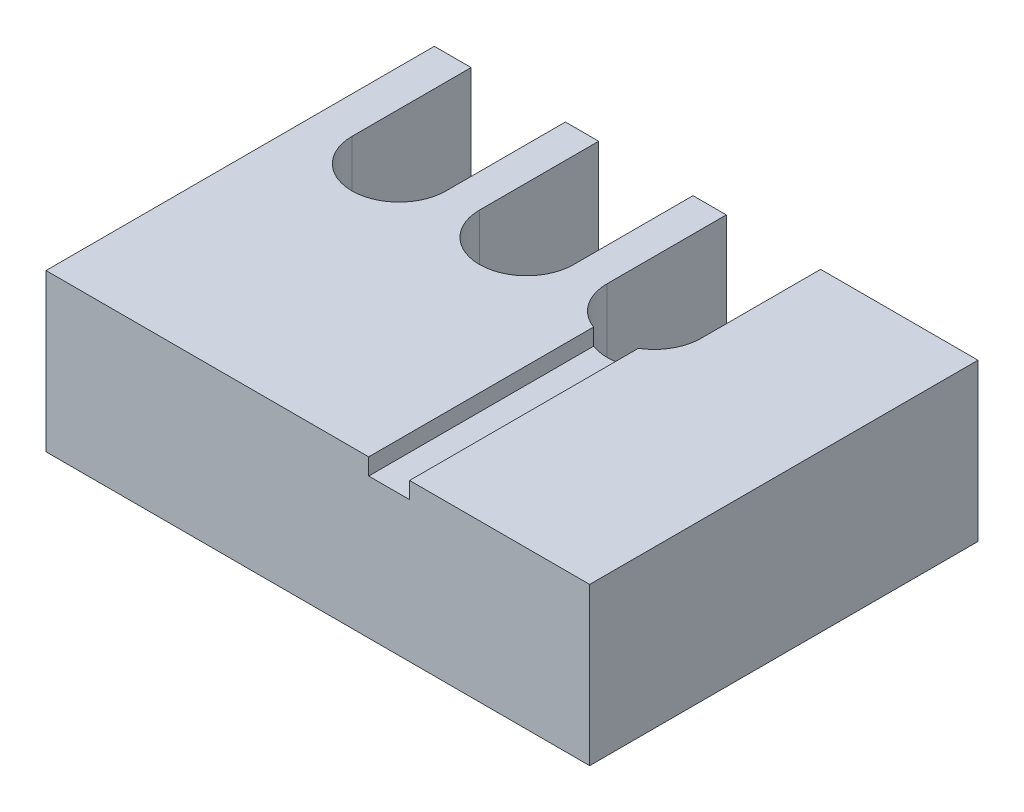
ISO-10303-21;
HEADER;
FILE_DESCRIPTION(('STEP AP214'),'2;1');
FILE_NAME('part.step','',(''),(''),'','','');
FILE_SCHEMA(('AUTOMOTIVE_DESIGN { 1 0 10303 214 1 1 1 1 }'));
ENDSEC;
DATA;
#1=APPLICATION_CONTEXT('core data for automotive mechanical design processes');
#2=APPLICATION_PROTOCOL_DEFINITION('international standard','automotive_design',2000,#1);
#3=PRODUCT_CONTEXT('',#1,'mechanical');
#4=PRODUCT('Part','Part','',(#3));
#5=PRODUCT_RELATED_PRODUCT_CATEGORY('part','',(#4));
#6=PRODUCT_DEFINITION_FORMATION('','',#4);
#7=PRODUCT_DEFINITION_CONTEXT('part definition',#1,'design');
#8=PRODUCT_DEFINITION('design','',#6,#7);
#9=PRODUCT_DEFINITION_SHAPE('','',#8);
#10=(LENGTH_UNIT() NAMED_UNIT(*) SI_UNIT(.MILLI.,.METRE.));
#11=(NAMED_UNIT(*) PLANE_ANGLE_UNIT() SI_UNIT($,.RADIAN.));
#12=(NAMED_UNIT(*) SI_UNIT($,.STERADIAN.) SOLID_ANGLE_UNIT());
#13=UNCERTAINTY_MEASURE_WITH_UNIT(LENGTH_MEASURE(1.E-05),#10,'distance_accuracy_value','');
#14=(GEOMETRIC_REPRESENTATION_CONTEXT(3) GLOBAL_UNCERTAINTY_ASSIGNED_CONTEXT((#13)) GLOBAL_UNIT_ASSIGNED_CONTEXT((#10,
#11,#12)) REPRESENTATION_CONTEXT('',''));
#15=CARTESIAN_POINT('',(0.,0.,0.));
#16=DIRECTION('',(0.,0.,1.));
#17=DIRECTION('',(1.,0.,0.));
#18=AXIS2_PLACEMENT_3D('',#15,#16,#17);
#19=CARTESIAN_POINT('',(0.,28.3,0.));
#20=DIRECTION('',(0.,-1.,0.));
#21=DIRECTION('',(0.,0.,-1.));
#22=AXIS2_PLACEMENT_3D('',#19,#20,#21);
#23=PLANE('',#22);
#24=DIRECTION('',(-1.,0.,0.));
#25=VECTOR('',#24,1.);
#26=CARTESIAN_POINT('',(0.,28.3,-70.));
#27=LINE('',#26,#25);
#28=CARTESIAN_POINT('',(26.63,28.3,-70.));
#29=VERTEX_POINT('',#28);
#30=CARTESIAN_POINT('',(20.63,28.3,-70.));
#31=VERTEX_POINT('',#30);
#32=EDGE_CURVE('E511',#29,#31,#27,.T.);
#33=ORIENTED_EDGE('',*,*,#32,.T.);
#34=DIRECTION('',(0.,0.,-1.));
#35=VECTOR('',#34,1.);
#36=CARTESIAN_POINT('',(20.63,28.3,-40.));
#37=LINE('',#36,#35);
#38=CARTESIAN_POINT('',(20.63,28.3,-48.5));
#39=VERTEX_POINT('',#38);
#40=EDGE_CURVE('E318',#39,#31,#37,.T.);
#41=ORIENTED_EDGE('',*,*,#40,.F.);
#42=CARTESIAN_POINT('',(12.13,28.3,-48.5));
#43=DIRECTION('',(0.,-1.,0.));
#44=DIRECTION('',(0.,0.,-1.));
#45=AXIS2_PLACEMENT_3D('',#42,#43,#44);
#46=CIRCLE('',#45,8.5);
#47=CARTESIAN_POINT('',(12.13,28.3,-40.));
#48=VERTEX_POINT('',#47);
#49=EDGE_CURVE('E378',#39,#48,#46,.T.);
#50=ORIENTED_EDGE('',*,*,#49,.T.);
#51=CARTESIAN_POINT('',(12.13,28.3,-48.5));
#52=DIRECTION('',(0.,-1.,0.));
#53=DIRECTION('',(0.,0.,-1.));
#54=AXIS2_PLACEMENT_3D('',#51,#52,#53);
#55=CIRCLE('',#54,8.5);
#56=CARTESIAN_POINT('',(3.63,28.3,-48.5));
#57=VERTEX_POINT('',#56);
#58=EDGE_CURVE('E374',#48,#57,#55,.T.);
#59=ORIENTED_EDGE('',*,*,#58,.T.);
#60=DIRECTION('',(0.,0.,-1.));
#61=VECTOR('',#60,1.);
#62=CARTESIAN_POINT('',(3.63,28.3,-40.));
#63=LINE('',#62,#61);
#64=CARTESIAN_POINT('',(3.63,28.3,-70.));
#65=VERTEX_POINT('',#64);
#66=EDGE_CURVE('E320',#57,#65,#63,.T.);
#67=ORIENTED_EDGE('',*,*,#66,.T.);
#68=CARTESIAN_POINT('',(-3.,28.3,-70.));
#69=VERTEX_POINT('',#68);
#70=EDGE_CURVE('E229',#65,#69,#27,.T.);
#71=ORIENTED_EDGE('',*,*,#70,.T.);
#72=DIRECTION('',(0.,0.,-1.));
#73=VECTOR('',#72,1.);
#74=CARTESIAN_POINT('',(-3.,28.3,-70.));
#75=LINE('',#74,#73);
#76=CARTESIAN_POINT('',(-3.,28.3,0.));
#77=VERTEX_POINT('',#76);
#78=EDGE_CURVE('E226',#77,#69,#75,.T.);
#79=ORIENTED_EDGE('',*,*,#78,.F.);
#80=DIRECTION('',(1.,0.,0.));
#81=VECTOR('',#80,1.);
#82=CARTESIAN_POINT('',(0.,28.3,0.));
#83=LINE('',#82,#81);
#84=CARTESIAN_POINT('',(55.17,28.3,0.));
#85=VERTEX_POINT('',#84);
#86=EDGE_CURVE('E213',#77,#85,#83,.T.);
#87=ORIENTED_EDGE('',*,*,#86,.T.);
#88=DIRECTION('',(0.,0.,1.));
#89=VECTOR('',#88,1.);
#90=CARTESIAN_POINT('',(55.17,28.3,-70.001));
#91=LINE('',#90,#89);
#92=CARTESIAN_POINT('',(55.17,28.3,-40.5320391567227));
#93=VERTEX_POINT('',#92);
#94=EDGE_CURVE('E331',#93,#85,#91,.T.);
#95=ORIENTED_EDGE('',*,*,#94,.F.);
#96=CARTESIAN_POINT('',(58.13,28.3,-48.5));
#97=DIRECTION('',(0.,-1.,0.));
#98=DIRECTION('',(0.,0.,-1.));
#99=AXIS2_PLACEMENT_3D('',#96,#97,#98);
#100=CIRCLE('',#99,8.5);
#101=CARTESIAN_POINT('',(49.63,28.3,-48.5));
#102=VERTEX_POINT('',#101);
#103=EDGE_CURVE('E398',#93,#102,#100,.T.);
#104=ORIENTED_EDGE('',*,*,#103,.T.);
#105=DIRECTION('',(0.,0.,-1.));
#106=VECTOR('',#105,1.);
#107=CARTESIAN_POINT('',(49.63,28.3,-40.));
#108=LINE('',#107,#106);
#109=CARTESIAN_POINT('',(49.63,28.3,-70.));
#110=VERTEX_POINT('',#109);
#111=EDGE_CURVE('E304',#102,#110,#108,.T.);
#112=ORIENTED_EDGE('',*,*,#111,.T.);
#113=CARTESIAN_POINT('',(43.63,28.3,-70.));
#114=VERTEX_POINT('',#113);
#115=EDGE_CURVE('E344',#110,#114,#27,.T.);
#116=ORIENTED_EDGE('',*,*,#115,.T.);
#117=DIRECTION('',(0.,0.,-1.));
#118=VECTOR('',#117,1.);
#119=CARTESIAN_POINT('',(43.63,28.3,-40.));
#120=LINE('',#119,#118);
#121=CARTESIAN_POINT('',(43.63,28.3,-48.5));
#122=VERTEX_POINT('',#121);
#123=EDGE_CURVE('E310',#122,#114,#120,.T.);
#124=ORIENTED_EDGE('',*,*,#123,.F.);
#125=CARTESIAN_POINT('',(35.13,28.3,-48.5));
#126=DIRECTION('',(0.,-1.,0.));
#127=DIRECTION('',(0.,0.,-1.));
#128=AXIS2_PLACEMENT_3D('',#125,#126,#127);
#129=CIRCLE('',#128,8.5);
#130=CARTESIAN_POINT('',(35.13,28.3,-40.));
#131=VERTEX_POINT('',#130);
#132=EDGE_CURVE('E387',#122,#131,#129,.T.);
#133=ORIENTED_EDGE('',*,*,#132,.T.);
#134=CARTESIAN_POINT('',(35.13,28.3,-48.5));
#135=DIRECTION('',(0.,-1.,0.));
#136=DIRECTION('',(0.,0.,-1.));
#137=AXIS2_PLACEMENT_3D('',#134,#135,#136);
#138=CIRCLE('',#137,8.5);
#139=CARTESIAN_POINT('',(26.63,28.3,-48.5));
#140=VERTEX_POINT('',#139);
#141=EDGE_CURVE('E383',#131,#140,#138,.T.);
#142=ORIENTED_EDGE('',*,*,#141,.T.);
#143=DIRECTION('',(0.,0.,-1.));
#144=VECTOR('',#143,1.);
#145=CARTESIAN_POINT('',(26.63,28.3,-40.));
#146=LINE('',#145,#144);
#147=EDGE_CURVE('E312',#140,#29,#146,.T.);
#148=ORIENTED_EDGE('',*,*,#147,.T.);
#149=EDGE_LOOP('',(#33,#41,#50,#59,#67,#71,#79,#87,#95,#104,#112,#116,#124,#133,#142,#148));
#150=FACE_BOUND('',#149,.T.);
#151=ADVANCED_FACE('F35',(#150),#23,.F.);
#152=CARTESIAN_POINT('',(0.,28.3,-70.));
#153=DIRECTION('',(0.,0.,1.));
#154=DIRECTION('',(1.,0.,0.));
#155=AXIS2_PLACEMENT_3D('',#152,#153,#154);
#156=PLANE('',#155);
#157=DIRECTION('',(0.,1.,0.));
#158=VECTOR('',#157,1.);
#159=CARTESIAN_POINT('',(71.13,0.,-70.));
#160=LINE('',#159,#158);
#161=CARTESIAN_POINT('',(71.13,0.,-70.));
#162=VERTEX_POINT('',#161);
#163=CARTESIAN_POINT('',(71.13,2.99999999999999,-70.));
#164=VERTEX_POINT('',#163);
#165=EDGE_CURVE('E254',#162,#164,#160,.T.);
#166=ORIENTED_EDGE('',*,*,#165,.T.);
#167=DIRECTION('',(-1.,0.,0.));
#168=VECTOR('',#167,1.);
#169=CARTESIAN_POINT('',(0.,3.,-70.));
#170=LINE('',#169,#168);
#171=CARTESIAN_POINT('',(66.63,2.99999999999999,-70.));
#172=VERTEX_POINT('',#171);
#173=EDGE_CURVE('E291',#164,#172,#170,.T.);
#174=ORIENTED_EDGE('',*,*,#173,.T.);
#175=DIRECTION('',(0.,-1.,0.));
#176=VECTOR('',#175,1.);
#177=CARTESIAN_POINT('',(66.63,0.,-70.));
#178=LINE('',#177,#176);
#179=CARTESIAN_POINT('',(66.63,28.3,-70.));
#180=VERTEX_POINT('',#179);
#181=EDGE_CURVE('E288',#180,#172,#178,.T.);
#182=ORIENTED_EDGE('',*,*,#181,.F.);
#183=CARTESIAN_POINT('',(95.,28.3,-70.));
#184=VERTEX_POINT('',#183);
#185=EDGE_CURVE('E340',#184,#180,#27,.T.);
#186=ORIENTED_EDGE('',*,*,#185,.F.);
#187=DIRECTION('',(0.,-1.,0.));
#188=VECTOR('',#187,1.);
#189=CARTESIAN_POINT('',(95.,28.3,-70.));
#190=LINE('',#189,#188);
#191=CARTESIAN_POINT('',(95.,0.,-70.));
#192=VERTEX_POINT('',#191);
#193=EDGE_CURVE('E343',#184,#192,#190,.T.);
#194=ORIENTED_EDGE('',*,*,#193,.T.);
#195=DIRECTION('',(-1.,0.,0.));
#196=VECTOR('',#195,1.);
#197=CARTESIAN_POINT('',(0.,0.,-70.));
#198=LINE('',#197,#196);
#199=EDGE_CURVE('E348',#192,#162,#198,.T.);
#200=ORIENTED_EDGE('',*,*,#199,.T.);
#201=EDGE_LOOP('',(#166,#174,#182,#186,#194,#200));
#202=FACE_BOUND('',#201,.T.);
#203=ADVANCED_FACE('F432',(#202),#156,.F.);
#204=DIRECTION('',(0.,-1.,0.));
#205=VECTOR('',#204,1.);
#206=CARTESIAN_POINT('',(49.63,0.,-70.));
#207=LINE('',#206,#205);
#208=CARTESIAN_POINT('',(49.63,2.99999999999999,-70.));
#209=VERTEX_POINT('',#208);
#210=EDGE_CURVE('E285',#110,#209,#207,.T.);
#211=ORIENTED_EDGE('',*,*,#210,.T.);
#212=DIRECTION('',(-1.,0.,0.));
#213=VECTOR('',#212,1.);
#214=CARTESIAN_POINT('',(0.,2.99999999999999,-70.));
#215=LINE('',#214,#213);
#216=CARTESIAN_POINT('',(43.63,2.99999999999999,-70.));
#217=VERTEX_POINT('',#216);
#218=EDGE_CURVE('E282',#209,#217,#215,.T.);
#219=ORIENTED_EDGE('',*,*,#218,.T.);
#220=DIRECTION('',(0.,-1.,0.));
#221=VECTOR('',#220,1.);
#222=CARTESIAN_POINT('',(43.63,0.,-70.));
#223=LINE('',#222,#221);
#224=EDGE_CURVE('E279',#114,#217,#223,.T.);
#225=ORIENTED_EDGE('',*,*,#224,.F.);
#226=ORIENTED_EDGE('',*,*,#115,.F.);
#227=EDGE_LOOP('',(#211,#219,#225,#226));
#228=FACE_BOUND('',#227,.T.);
#229=ADVANCED_FACE('F453',(#228),#156,.F.);
#230=DIRECTION('',(0.,-1.,0.));
#231=VECTOR('',#230,1.);
#232=CARTESIAN_POINT('',(26.63,0.,-70.));
#233=LINE('',#232,#231);
#234=CARTESIAN_POINT('',(26.63,3.,-70.));
#235=VERTEX_POINT('',#234);
#236=EDGE_CURVE('E276',#29,#235,#233,.T.);
#237=ORIENTED_EDGE('',*,*,#236,.T.);
#238=DIRECTION('',(-1.,0.,0.));
#239=VECTOR('',#238,1.);
#240=CARTESIAN_POINT('',(0.,3.,-70.));
#241=LINE('',#240,#239);
#242=CARTESIAN_POINT('',(20.63,3.,-70.));
#243=VERTEX_POINT('',#242);
#244=EDGE_CURVE('E273',#235,#243,#241,.T.);
#245=ORIENTED_EDGE('',*,*,#244,.T.);
#246=DIRECTION('',(0.,-1.,0.));
#247=VECTOR('',#246,1.);
#248=CARTESIAN_POINT('',(20.63,0.,-70.));
#249=LINE('',#248,#247);
#250=EDGE_CURVE('E270',#31,#243,#249,.T.);
#251=ORIENTED_EDGE('',*,*,#250,.F.);
#252=ORIENTED_EDGE('',*,*,#32,.F.);
#253=EDGE_LOOP('',(#237,#245,#251,#252));
#254=FACE_BOUND('',#253,.T.);
#255=ADVANCED_FACE('F519',(#254),#156,.F.);
#256=DIRECTION('',(0.,-1.,0.));
#257=VECTOR('',#256,1.);
#258=CARTESIAN_POINT('',(3.63,0.,-70.));
#259=LINE('',#258,#257);
#260=CARTESIAN_POINT('',(3.63,3.,-70.));
#261=VERTEX_POINT('',#260);
#262=EDGE_CURVE('E266',#65,#261,#259,.T.);
#263=ORIENTED_EDGE('',*,*,#262,.T.);
#264=DIRECTION('',(1.,0.,0.));
#265=VECTOR('',#264,1.);
#266=CARTESIAN_POINT('',(0.,3.,-70.));
#267=LINE('',#266,#265);
#268=CARTESIAN_POINT('',(-3.,3.,-70.));
#269=VERTEX_POINT('',#268);
#270=EDGE_CURVE('E263',#269,#261,#267,.T.);
#271=ORIENTED_EDGE('',*,*,#270,.F.);
#272=DIRECTION('',(0.,-1.,0.));
#273=VECTOR('',#272,1.);
#274=CARTESIAN_POINT('',(-3.,3.,-70.));
#275=LINE('',#274,#273);
#276=EDGE_CURVE('E233',#69,#269,#275,.T.);
#277=ORIENTED_EDGE('',*,*,#276,.F.);
#278=ORIENTED_EDGE('',*,*,#70,.F.);
#279=EDGE_LOOP('',(#263,#271,#277,#278));
#280=FACE_BOUND('',#279,.T.);
#281=ADVANCED_FACE('F455',(#280),#156,.F.);
#282=CARTESIAN_POINT('',(0.,0.,0.));
#283=DIRECTION('',(0.,-1.,0.));
#284=DIRECTION('',(0.,0.,-1.));
#285=AXIS2_PLACEMENT_3D('',#282,#283,#284);
#286=PLANE('',#285);
#287=DIRECTION('',(-1.,0.,0.));
#288=VECTOR('',#287,1.);
#289=CARTESIAN_POINT('',(0.,0.,-40.));
#290=LINE('',#289,#288);
#291=CARTESIAN_POINT('',(63.13,0.,-40.));
#292=VERTEX_POINT('',#291);
#293=CARTESIAN_POINT('',(-3.,0.,-40.));
#294=VERTEX_POINT('',#293);
#295=EDGE_CURVE('E260',#292,#294,#290,.T.);
#296=ORIENTED_EDGE('',*,*,#295,.F.);
#297=CARTESIAN_POINT('',(63.13,0.,-48.));
#298=DIRECTION('',(0.,-1.,0.));
#299=DIRECTION('',(0.,0.,-1.));
#300=AXIS2_PLACEMENT_3D('',#297,#298,#299);
#301=CIRCLE('',#300,8.);
#302=CARTESIAN_POINT('',(71.13,0.,-48.));
#303=VERTEX_POINT('',#302);
#304=EDGE_CURVE('E11',#292,#303,#301,.F.);
#305=ORIENTED_EDGE('',*,*,#304,.T.);
#306=DIRECTION('',(0.,0.,-1.));
#307=VECTOR('',#306,1.);
#308=CARTESIAN_POINT('',(71.13,0.,-40.));
#309=LINE('',#308,#307);
#310=EDGE_CURVE('E296',#303,#162,#309,.T.);
#311=ORIENTED_EDGE('',*,*,#310,.T.);
#312=ORIENTED_EDGE('',*,*,#199,.F.);
#313=DIRECTION('',(0.,0.,-1.));
#314=VECTOR('',#313,1.);
#315=CARTESIAN_POINT('',(95.,0.,0.));
#316=LINE('',#315,#314);
#317=CARTESIAN_POINT('',(95.,0.,0.));
#318=VERTEX_POINT('',#317);
#319=EDGE_CURVE('E346',#318,#192,#316,.T.);
#320=ORIENTED_EDGE('',*,*,#319,.F.);
#321=DIRECTION('',(1.,0.,0.));
#322=VECTOR('',#321,1.);
#323=CARTESIAN_POINT('',(0.,0.,0.));
#324=LINE('',#323,#322);
#325=CARTESIAN_POINT('',(-3.,0.,0.));
#326=VERTEX_POINT('',#325);
#327=EDGE_CURVE('E333',#326,#318,#324,.T.);
#328=ORIENTED_EDGE('',*,*,#327,.F.);
#329=DIRECTION('',(0.,0.,1.));
#330=VECTOR('',#329,1.);
#331=CARTESIAN_POINT('',(-3.,0.,0.));
#332=LINE('',#331,#330);
#333=EDGE_CURVE('E239',#294,#326,#332,.T.);
#334=ORIENTED_EDGE('',*,*,#333,.F.);
#335=EDGE_LOOP('',(#296,#305,#311,#312,#320,#328,#334));
#336=FACE_BOUND('',#335,.T.);
#337=ADVANCED_FACE('F438',(#336),#286,.T.);
#338=CARTESIAN_POINT('',(55.17,28.3,-70.001));
#339=DIRECTION('',(-1.,0.,0.));
#340=DIRECTION('',(0.,0.,1.));
#341=AXIS2_PLACEMENT_3D('',#338,#339,#340);
#342=PLANE('',#341);
#343=DIRECTION('',(0.,0.,1.));
#344=VECTOR('',#343,1.);
#345=CARTESIAN_POINT('',(55.17,25.3,-70.001));
#346=LINE('',#345,#344);
#347=CARTESIAN_POINT('',(55.17,25.3,-40.5320391567227));
#348=VERTEX_POINT('',#347);
#349=CARTESIAN_POINT('',(55.17,25.3,0.));
#350=VERTEX_POINT('',#349);
#351=EDGE_CURVE('E330',#348,#350,#346,.T.);
#352=ORIENTED_EDGE('',*,*,#351,.F.);
#353=DIRECTION('',(0.,1.,0.));
#354=VECTOR('',#353,1.);
#355=CARTESIAN_POINT('',(55.17,25.3,-40.5320391567227));
#356=LINE('',#355,#354);
#357=EDGE_CURVE('E395',#348,#93,#356,.T.);
#358=ORIENTED_EDGE('',*,*,#357,.T.);
#359=ORIENTED_EDGE('',*,*,#94,.T.);
#360=DIRECTION('',(0.,-1.,0.));
#361=VECTOR('',#360,1.);
#362=CARTESIAN_POINT('',(55.17,28.3,0.));
#363=LINE('',#362,#361);
#364=EDGE_CURVE('E220',#85,#350,#363,.T.);
#365=ORIENTED_EDGE('',*,*,#364,.T.);
#366=EDGE_LOOP('',(#352,#358,#359,#365));
#367=FACE_BOUND('',#366,.T.);
#368=ADVANCED_FACE('F491',(#367),#342,.F.);
#369=CARTESIAN_POINT('',(62.54,28.3,-70.001));
#370=DIRECTION('',(1.,0.,0.));
#371=DIRECTION('',(0.,0.,-1.));
#372=AXIS2_PLACEMENT_3D('',#369,#370,#371);
#373=PLANE('',#372);
#374=DIRECTION('',(0.,0.,1.));
#375=VECTOR('',#374,1.);
#376=CARTESIAN_POINT('',(62.54,28.3,-70.001));
#377=LINE('',#376,#375);
#378=CARTESIAN_POINT('',(62.54,28.3,-41.2335084118951));
#379=VERTEX_POINT('',#378);
#380=CARTESIAN_POINT('',(62.54,28.3,0.));
#381=VERTEX_POINT('',#380);
#382=EDGE_CURVE('E334',#379,#381,#377,.T.);
#383=ORIENTED_EDGE('',*,*,#382,.F.);
#384=DIRECTION('',(0.,-1.,0.));
#385=VECTOR('',#384,1.);
#386=CARTESIAN_POINT('',(62.54,28.3,-41.2335084118951));
#387=LINE('',#386,#385);
#388=CARTESIAN_POINT('',(62.54,25.3,-41.2335084118951));
#389=VERTEX_POINT('',#388);
#390=EDGE_CURVE('E405',#379,#389,#387,.T.);
#391=ORIENTED_EDGE('',*,*,#390,.T.);
#392=DIRECTION('',(0.,0.,1.));
#393=VECTOR('',#392,1.);
#394=CARTESIAN_POINT('',(62.54,25.3,-70.001));
#395=LINE('',#394,#393);
#396=CARTESIAN_POINT('',(62.54,25.3,0.));
#397=VERTEX_POINT('',#396);
#398=EDGE_CURVE('E336',#389,#397,#395,.T.);
#399=ORIENTED_EDGE('',*,*,#398,.T.);
#400=DIRECTION('',(0.,1.,0.));
#401=VECTOR('',#400,1.);
#402=CARTESIAN_POINT('',(62.54,28.3,0.));
#403=LINE('',#402,#401);
#404=EDGE_CURVE('E327',#397,#381,#403,.T.);
#405=ORIENTED_EDGE('',*,*,#404,.T.);
#406=EDGE_LOOP('',(#383,#391,#399,#405));
#407=FACE_BOUND('',#406,.T.);
#408=ADVANCED_FACE('F485',(#407),#373,.F.);
#409=CARTESIAN_POINT('',(55.17,25.3,-70.001));
#410=DIRECTION('',(0.,-1.,0.));
#411=DIRECTION('',(0.,0.,-1.));
#412=AXIS2_PLACEMENT_3D('',#409,#410,#411);
#413=PLANE('',#412);
#414=ORIENTED_EDGE('',*,*,#398,.F.);
#415=CARTESIAN_POINT('',(58.13,25.3,-48.5));
#416=DIRECTION('',(0.,-1.,0.));
#417=DIRECTION('',(0.,0.,-1.));
#418=AXIS2_PLACEMENT_3D('',#415,#416,#417);
#419=CIRCLE('',#418,8.5);
#420=CARTESIAN_POINT('',(58.13,25.3,-40.));
#421=VERTEX_POINT('',#420);
#422=EDGE_CURVE('E408',#389,#421,#419,.T.);
#423=ORIENTED_EDGE('',*,*,#422,.T.);
#424=CARTESIAN_POINT('',(58.13,25.3,-48.5));
#425=DIRECTION('',(0.,-1.,0.));
#426=DIRECTION('',(0.,0.,-1.));
#427=AXIS2_PLACEMENT_3D('',#424,#425,#426);
#428=CIRCLE('',#427,8.5);
#429=EDGE_CURVE('E392',#421,#348,#428,.T.);
#430=ORIENTED_EDGE('',*,*,#429,.T.);
#431=ORIENTED_EDGE('',*,*,#351,.T.);
#432=DIRECTION('',(1.,0.,0.));
#433=VECTOR('',#432,1.);
#434=CARTESIAN_POINT('',(55.17,25.3,0.));
#435=LINE('',#434,#433);
#436=EDGE_CURVE('E324',#350,#397,#435,.T.);
#437=ORIENTED_EDGE('',*,*,#436,.T.);
#438=EDGE_LOOP('',(#414,#423,#430,#431,#437));
#439=FACE_BOUND('',#438,.T.);
#440=ADVANCED_FACE('F487',(#439),#413,.F.);
#441=CARTESIAN_POINT('',(0.,28.3,0.));
#442=DIRECTION('',(0.,0.,-1.));
#443=DIRECTION('',(-1.,0.,0.));
#444=AXIS2_PLACEMENT_3D('',#441,#442,#443);
#445=PLANE('',#444);
#446=ORIENTED_EDGE('',*,*,#436,.F.);
#447=ORIENTED_EDGE('',*,*,#364,.F.);
#448=ORIENTED_EDGE('',*,*,#86,.F.);
#449=DIRECTION('',(0.,1.,0.));
#450=VECTOR('',#449,1.);
#451=CARTESIAN_POINT('',(-3.,28.3,0.));
#452=LINE('',#451,#450);
#453=EDGE_CURVE('E218',#326,#77,#452,.T.);
#454=ORIENTED_EDGE('',*,*,#453,.F.);
#455=ORIENTED_EDGE('',*,*,#327,.T.);
#456=DIRECTION('',(0.,-1.,0.));
#457=VECTOR('',#456,1.);
#458=CARTESIAN_POINT('',(95.,28.3,0.));
#459=LINE('',#458,#457);
#460=CARTESIAN_POINT('',(95.,28.3,0.));
#461=VERTEX_POINT('',#460);
#462=EDGE_CURVE('E353',#461,#318,#459,.T.);
#463=ORIENTED_EDGE('',*,*,#462,.F.);
#464=EDGE_CURVE('E223',#381,#461,#83,.T.);
#465=ORIENTED_EDGE('',*,*,#464,.F.);
#466=ORIENTED_EDGE('',*,*,#404,.F.);
#467=EDGE_LOOP('',(#446,#447,#448,#454,#455,#463,#465,#466));
#468=FACE_BOUND('',#467,.T.);
#469=ADVANCED_FACE('F216',(#468),#445,.F.);
#470=CARTESIAN_POINT('',(95.,28.3,0.));
#471=DIRECTION('',(-1.,0.,0.));
#472=DIRECTION('',(0.,0.,1.));
#473=AXIS2_PLACEMENT_3D('',#470,#471,#472);
#474=PLANE('',#473);
#475=ORIENTED_EDGE('',*,*,#319,.T.);
#476=ORIENTED_EDGE('',*,*,#193,.F.);
#477=DIRECTION('',(0.,0.,-1.));
#478=VECTOR('',#477,1.);
#479=CARTESIAN_POINT('',(95.,28.3,0.));
#480=LINE('',#479,#478);
#481=EDGE_CURVE('E222',#461,#184,#480,.T.);
#482=ORIENTED_EDGE('',*,*,#481,.F.);
#483=ORIENTED_EDGE('',*,*,#462,.T.);
#484=EDGE_LOOP('',(#475,#476,#482,#483));
#485=FACE_BOUND('',#484,.T.);
#486=ADVANCED_FACE('F459',(#485),#474,.F.);
#487=ORIENTED_EDGE('',*,*,#185,.T.);
#488=DIRECTION('',(0.,0.,-1.));
#489=VECTOR('',#488,1.);
#490=CARTESIAN_POINT('',(66.63,28.3,-40.));
#491=LINE('',#490,#489);
#492=CARTESIAN_POINT('',(66.63,28.3,-48.5));
#493=VERTEX_POINT('',#492);
#494=EDGE_CURVE('E302',#493,#180,#491,.T.);
#495=ORIENTED_EDGE('',*,*,#494,.F.);
#496=CARTESIAN_POINT('',(58.13,28.3,-48.5));
#497=DIRECTION('',(0.,-1.,0.));
#498=DIRECTION('',(0.,0.,-1.));
#499=AXIS2_PLACEMENT_3D('',#496,#497,#498);
#500=CIRCLE('',#499,8.5);
#501=EDGE_CURVE('E402',#493,#379,#500,.T.);
#502=ORIENTED_EDGE('',*,*,#501,.T.);
#503=ORIENTED_EDGE('',*,*,#382,.T.);
#504=ORIENTED_EDGE('',*,*,#464,.T.);
#505=ORIENTED_EDGE('',*,*,#481,.T.);
#506=EDGE_LOOP('',(#487,#495,#502,#503,#504,#505));
#507=FACE_BOUND('',#506,.T.);
#508=ADVANCED_FACE('F447',(#507),#23,.F.);
#509=CARTESIAN_POINT('',(71.13,0.,-40.));
#510=DIRECTION('',(-1.,0.,0.));
#511=DIRECTION('',(0.,0.,1.));
#512=AXIS2_PLACEMENT_3D('',#509,#510,#511);
#513=PLANE('',#512);
#514=ORIENTED_EDGE('',*,*,#310,.F.);
#515=DIRECTION('',(0.,1.,0.));
#516=VECTOR('',#515,1.);
#517=CARTESIAN_POINT('',(71.13,2.99999999999999,-48.));
#518=LINE('',#517,#516);
#519=CARTESIAN_POINT('',(71.13,2.99999999999999,-48.));
#520=VERTEX_POINT('',#519);
#521=EDGE_CURVE('E410',#303,#520,#518,.T.);
#522=ORIENTED_EDGE('',*,*,#521,.T.);
#523=DIRECTION('',(0.,0.,-1.));
#524=VECTOR('',#523,1.);
#525=CARTESIAN_POINT('',(71.13,2.99999999999999,-40.));
#526=LINE('',#525,#524);
#527=EDGE_CURVE('E298',#520,#164,#526,.T.);
#528=ORIENTED_EDGE('',*,*,#527,.T.);
#529=ORIENTED_EDGE('',*,*,#165,.F.);
#530=EDGE_LOOP('',(#514,#522,#528,#529));
#531=FACE_BOUND('',#530,.T.);
#532=ADVANCED_FACE('F423',(#531),#513,.T.);
#533=CARTESIAN_POINT('',(0.,3.,-40.));
#534=DIRECTION('',(0.,-1.,0.));
#535=DIRECTION('',(1.,0.,0.));
#536=AXIS2_PLACEMENT_3D('',#533,#534,#535);
#537=PLANE('',#536);
#538=ORIENTED_EDGE('',*,*,#527,.F.);
#539=CARTESIAN_POINT('',(63.13,2.99999999999999,-48.));
#540=DIRECTION('',(0.,-1.,0.));
#541=DIRECTION('',(1.,0.,0.));
#542=AXIS2_PLACEMENT_3D('',#539,#540,#541);
#543=CIRCLE('',#542,8.);
#544=CARTESIAN_POINT('',(63.13,2.99999999999999,-40.));
#545=VERTEX_POINT('',#544);
#546=EDGE_CURVE('E57',#520,#545,#543,.T.);
#547=ORIENTED_EDGE('',*,*,#546,.T.);
#548=DIRECTION('',(-1.,0.,0.));
#549=VECTOR('',#548,1.);
#550=CARTESIAN_POINT('',(0.,3.,-40.));
#551=LINE('',#550,#549);
#552=CARTESIAN_POINT('',(58.13,2.99999999999999,-40.));
#553=VERTEX_POINT('',#552);
#554=EDGE_CURVE('E258',#545,#553,#551,.T.);
#555=ORIENTED_EDGE('',*,*,#554,.T.);
#556=CARTESIAN_POINT('',(58.13,2.99999999999999,-48.5));
#557=DIRECTION('',(0.,-1.,0.));
#558=DIRECTION('',(1.,0.,0.));
#559=AXIS2_PLACEMENT_3D('',#556,#557,#558);
#560=CIRCLE('',#559,8.5);
#561=CARTESIAN_POINT('',(66.63,2.99999999999999,-48.5));
#562=VERTEX_POINT('',#561);
#563=EDGE_CURVE('E400',#553,#562,#560,.F.);
#564=ORIENTED_EDGE('',*,*,#563,.T.);
#565=DIRECTION('',(0.,0.,-1.));
#566=VECTOR('',#565,1.);
#567=CARTESIAN_POINT('',(66.63,2.99999999999999,-40.));
#568=LINE('',#567,#566);
#569=EDGE_CURVE('E300',#562,#172,#568,.T.);
#570=ORIENTED_EDGE('',*,*,#569,.T.);
#571=ORIENTED_EDGE('',*,*,#173,.F.);
#572=EDGE_LOOP('',(#538,#547,#555,#564,#570,#571));
#573=FACE_BOUND('',#572,.T.);
#574=ADVANCED_FACE('F428',(#573),#537,.T.);
#575=CARTESIAN_POINT('',(66.63,0.,-40.));
#576=DIRECTION('',(1.,0.,0.));
#577=DIRECTION('',(0.,0.,-1.));
#578=AXIS2_PLACEMENT_3D('',#575,#576,#577);
#579=PLANE('',#578);
#580=ORIENTED_EDGE('',*,*,#569,.F.);
#581=DIRECTION('',(0.,-1.,0.));
#582=VECTOR('',#581,1.);
#583=CARTESIAN_POINT('',(66.63,0.,-48.5));
#584=LINE('',#583,#582);
#585=EDGE_CURVE('E369',#562,#493,#584,.F.);
#586=ORIENTED_EDGE('',*,*,#585,.T.);
#587=ORIENTED_EDGE('',*,*,#494,.T.);
#588=ORIENTED_EDGE('',*,*,#181,.T.);
#589=EDGE_LOOP('',(#580,#586,#587,#588));
#590=FACE_BOUND('',#589,.T.);
#591=ADVANCED_FACE('F473',(#590),#579,.F.);
#592=CARTESIAN_POINT('',(49.63,0.,-40.));
#593=DIRECTION('',(1.,0.,0.));
#594=DIRECTION('',(0.,0.,-1.));
#595=AXIS2_PLACEMENT_3D('',#592,#593,#594);
#596=PLANE('',#595);
#597=ORIENTED_EDGE('',*,*,#111,.F.);
#598=DIRECTION('',(0.,-1.,0.));
#599=VECTOR('',#598,1.);
#600=CARTESIAN_POINT('',(49.63,2.99999999999999,-48.5));
#601=LINE('',#600,#599);
#602=CARTESIAN_POINT('',(49.63,2.99999999999999,-48.5));
#603=VERTEX_POINT('',#602);
#604=EDGE_CURVE('E366',#102,#603,#601,.T.);
#605=ORIENTED_EDGE('',*,*,#604,.T.);
#606=DIRECTION('',(0.,0.,-1.));
#607=VECTOR('',#606,1.);
#608=CARTESIAN_POINT('',(49.63,2.99999999999999,-40.));
#609=LINE('',#608,#607);
#610=EDGE_CURVE('E306',#603,#209,#609,.T.);
#611=ORIENTED_EDGE('',*,*,#610,.T.);
#612=ORIENTED_EDGE('',*,*,#210,.F.);
#613=EDGE_LOOP('',(#597,#605,#611,#612));
#614=FACE_BOUND('',#613,.T.);
#615=ADVANCED_FACE('F499',(#614),#596,.T.);
#616=CARTESIAN_POINT('',(0.,2.99999999999999,-40.));
#617=DIRECTION('',(0.,-1.,0.));
#618=DIRECTION('',(0.,0.,-1.));
#619=AXIS2_PLACEMENT_3D('',#616,#617,#618);
#620=PLANE('',#619);
#621=ORIENTED_EDGE('',*,*,#218,.F.);
#622=ORIENTED_EDGE('',*,*,#610,.F.);
#623=CARTESIAN_POINT('',(58.13,2.99999999999999,-48.5));
#624=DIRECTION('',(0.,-1.,0.));
#625=DIRECTION('',(0.,0.,-1.));
#626=AXIS2_PLACEMENT_3D('',#623,#624,#625);
#627=CIRCLE('',#626,8.5);
#628=EDGE_CURVE('E389',#603,#553,#627,.F.);
#629=ORIENTED_EDGE('',*,*,#628,.T.);
#630=DIRECTION('',(-1.,0.,0.));
#631=VECTOR('',#630,1.);
#632=CARTESIAN_POINT('',(0.,2.99999999999999,-40.));
#633=LINE('',#632,#631);
#634=CARTESIAN_POINT('',(35.13,2.99999999999999,-40.));
#635=VERTEX_POINT('',#634);
#636=EDGE_CURVE('E256',#553,#635,#633,.T.);
#637=ORIENTED_EDGE('',*,*,#636,.T.);
#638=CARTESIAN_POINT('',(35.13,2.99999999999999,-48.5));
#639=DIRECTION('',(0.,-1.,0.));
#640=DIRECTION('',(0.,0.,-1.));
#641=AXIS2_PLACEMENT_3D('',#638,#639,#640);
#642=CIRCLE('',#641,8.5);
#643=CARTESIAN_POINT('',(43.63,2.99999999999999,-48.5));
#644=VERTEX_POINT('',#643);
#645=EDGE_CURVE('E385',#635,#644,#642,.F.);
#646=ORIENTED_EDGE('',*,*,#645,.T.);
#647=DIRECTION('',(0.,0.,-1.));
#648=VECTOR('',#647,1.);
#649=CARTESIAN_POINT('',(43.63,2.99999999999999,-40.));
#650=LINE('',#649,#648);
#651=EDGE_CURVE('E308',#644,#217,#650,.T.);
#652=ORIENTED_EDGE('',*,*,#651,.T.);
#653=EDGE_LOOP('',(#621,#622,#629,#637,#646,#652));
#654=FACE_BOUND('',#653,.T.);
#655=ADVANCED_FACE('F504',(#654),#620,.T.);
#656=CARTESIAN_POINT('',(43.63,0.,-40.));
#657=DIRECTION('',(1.,0.,0.));
#658=DIRECTION('',(0.,0.,-1.));
#659=AXIS2_PLACEMENT_3D('',#656,#657,#658);
#660=PLANE('',#659);
#661=ORIENTED_EDGE('',*,*,#651,.F.);
#662=DIRECTION('',(0.,-1.,0.));
#663=VECTOR('',#662,1.);
#664=CARTESIAN_POINT('',(43.63,0.,-48.5));
#665=LINE('',#664,#663);
#666=EDGE_CURVE('E364',#644,#122,#665,.F.);
#667=ORIENTED_EDGE('',*,*,#666,.T.);
#668=ORIENTED_EDGE('',*,*,#123,.T.);
#669=ORIENTED_EDGE('',*,*,#224,.T.);
#670=EDGE_LOOP('',(#661,#667,#668,#669));
#671=FACE_BOUND('',#670,.T.);
#672=ADVANCED_FACE('F560',(#671),#660,.F.);
#673=CARTESIAN_POINT('',(26.63,0.,-40.));
#674=DIRECTION('',(1.,0.,0.));
#675=DIRECTION('',(0.,1.,0.));
#676=AXIS2_PLACEMENT_3D('',#673,#674,#675);
#677=PLANE('',#676);
#678=ORIENTED_EDGE('',*,*,#147,.F.);
#679=DIRECTION('',(0.,-1.,0.));
#680=VECTOR('',#679,1.);
#681=CARTESIAN_POINT('',(26.63,3.,-48.5));
#682=LINE('',#681,#680);
#683=CARTESIAN_POINT('',(26.63,3.,-48.5));
#684=VERTEX_POINT('',#683);
#685=EDGE_CURVE('E361',#140,#684,#682,.T.);
#686=ORIENTED_EDGE('',*,*,#685,.T.);
#687=DIRECTION('',(0.,0.,-1.));
#688=VECTOR('',#687,1.);
#689=CARTESIAN_POINT('',(26.63,3.,-40.));
#690=LINE('',#689,#688);
#691=EDGE_CURVE('E314',#684,#235,#690,.T.);
#692=ORIENTED_EDGE('',*,*,#691,.T.);
#693=ORIENTED_EDGE('',*,*,#236,.F.);
#694=EDGE_LOOP('',(#678,#686,#692,#693));
#695=FACE_BOUND('',#694,.T.);
#696=ADVANCED_FACE('F558',(#695),#677,.T.);
#697=CARTESIAN_POINT('',(0.,3.,-40.));
#698=DIRECTION('',(0.,-1.,0.));
#699=DIRECTION('',(0.,0.,-1.));
#700=AXIS2_PLACEMENT_3D('',#697,#698,#699);
#701=PLANE('',#700);
#702=ORIENTED_EDGE('',*,*,#244,.F.);
#703=ORIENTED_EDGE('',*,*,#691,.F.);
#704=CARTESIAN_POINT('',(35.13,3.,-48.5));
#705=DIRECTION('',(0.,-1.,0.));
#706=DIRECTION('',(0.,0.,-1.));
#707=AXIS2_PLACEMENT_3D('',#704,#705,#706);
#708=CIRCLE('',#707,8.5);
#709=EDGE_CURVE('E380',#684,#635,#708,.F.);
#710=ORIENTED_EDGE('',*,*,#709,.T.);
#711=DIRECTION('',(-1.,0.,0.));
#712=VECTOR('',#711,1.);
#713=CARTESIAN_POINT('',(0.,3.,-40.));
#714=LINE('',#713,#712);
#715=CARTESIAN_POINT('',(12.13,3.,-40.));
#716=VERTEX_POINT('',#715);
#717=EDGE_CURVE('E253',#635,#716,#714,.T.);
#718=ORIENTED_EDGE('',*,*,#717,.T.);
#719=CARTESIAN_POINT('',(12.13,3.,-48.5));
#720=DIRECTION('',(0.,-1.,0.));
#721=DIRECTION('',(0.,0.,-1.));
#722=AXIS2_PLACEMENT_3D('',#719,#720,#721);
#723=CIRCLE('',#722,8.5);
#724=CARTESIAN_POINT('',(20.63,3.,-48.5));
#725=VERTEX_POINT('',#724);
#726=EDGE_CURVE('E376',#716,#725,#723,.F.);
#727=ORIENTED_EDGE('',*,*,#726,.T.);
#728=DIRECTION('',(0.,0.,-1.));
#729=VECTOR('',#728,1.);
#730=CARTESIAN_POINT('',(20.63,3.,-40.));
#731=LINE('',#730,#729);
#732=EDGE_CURVE('E316',#725,#243,#731,.T.);
#733=ORIENTED_EDGE('',*,*,#732,.T.);
#734=EDGE_LOOP('',(#702,#703,#710,#718,#727,#733));
#735=FACE_BOUND('',#734,.T.);
#736=ADVANCED_FACE('F547',(#735),#701,.T.);
#737=CARTESIAN_POINT('',(20.63,0.,-40.));
#738=DIRECTION('',(1.,0.,0.));
#739=DIRECTION('',(0.,1.,0.));
#740=AXIS2_PLACEMENT_3D('',#737,#738,#739);
#741=PLANE('',#740);
#742=ORIENTED_EDGE('',*,*,#732,.F.);
#743=DIRECTION('',(0.,-1.,0.));
#744=VECTOR('',#743,1.);
#745=CARTESIAN_POINT('',(20.63,0.,-48.5));
#746=LINE('',#745,#744);
#747=EDGE_CURVE('E359',#725,#39,#746,.F.);
#748=ORIENTED_EDGE('',*,*,#747,.T.);
#749=ORIENTED_EDGE('',*,*,#40,.T.);
#750=ORIENTED_EDGE('',*,*,#250,.T.);
#751=EDGE_LOOP('',(#742,#748,#749,#750));
#752=FACE_BOUND('',#751,.T.);
#753=ADVANCED_FACE('F523',(#752),#741,.F.);
#754=CARTESIAN_POINT('',(3.63,0.,-40.));
#755=DIRECTION('',(1.,0.,0.));
#756=DIRECTION('',(0.,1.,0.));
#757=AXIS2_PLACEMENT_3D('',#754,#755,#756);
#758=PLANE('',#757);
#759=ORIENTED_EDGE('',*,*,#66,.F.);
#760=DIRECTION('',(0.,-1.,0.));
#761=VECTOR('',#760,1.);
#762=CARTESIAN_POINT('',(3.63,3.,-48.5));
#763=LINE('',#762,#761);
#764=CARTESIAN_POINT('',(3.63,3.,-48.5));
#765=VERTEX_POINT('',#764);
#766=EDGE_CURVE('E356',#57,#765,#763,.T.);
#767=ORIENTED_EDGE('',*,*,#766,.T.);
#768=DIRECTION('',(0.,0.,-1.));
#769=VECTOR('',#768,1.);
#770=CARTESIAN_POINT('',(3.63,3.,-40.));
#771=LINE('',#770,#769);
#772=EDGE_CURVE('E262',#765,#261,#771,.T.);
#773=ORIENTED_EDGE('',*,*,#772,.T.);
#774=ORIENTED_EDGE('',*,*,#262,.F.);
#775=EDGE_LOOP('',(#759,#767,#773,#774));
#776=FACE_BOUND('',#775,.T.);
#777=ADVANCED_FACE('F535',(#776),#758,.T.);
#778=CARTESIAN_POINT('',(0.,3.,-40.));
#779=DIRECTION('',(0.,1.,0.));
#780=DIRECTION('',(-1.,0.,0.));
#781=AXIS2_PLACEMENT_3D('',#778,#779,#780);
#782=PLANE('',#781);
#783=ORIENTED_EDGE('',*,*,#270,.T.);
#784=ORIENTED_EDGE('',*,*,#772,.F.);
#785=CARTESIAN_POINT('',(12.13,3.,-48.5));
#786=DIRECTION('',(0.,1.,0.));
#787=DIRECTION('',(-1.,0.,0.));
#788=AXIS2_PLACEMENT_3D('',#785,#786,#787);
#789=CIRCLE('',#788,8.5);
#790=EDGE_CURVE('E371',#765,#716,#789,.T.);
#791=ORIENTED_EDGE('',*,*,#790,.T.);
#792=DIRECTION('',(1.,0.,0.));
#793=VECTOR('',#792,1.);
#794=CARTESIAN_POINT('',(0.,3.,-40.));
#795=LINE('',#794,#793);
#796=CARTESIAN_POINT('',(-3.,2.99999999999999,-40.));
#797=VERTEX_POINT('',#796);
#798=EDGE_CURVE('E250',#797,#716,#795,.T.);
#799=ORIENTED_EDGE('',*,*,#798,.F.);
#800=DIRECTION('',(0.,0.,1.));
#801=VECTOR('',#800,1.);
#802=CARTESIAN_POINT('',(-3.,2.99999999999999,-40.));
#803=LINE('',#802,#801);
#804=EDGE_CURVE('E243',#269,#797,#803,.T.);
#805=ORIENTED_EDGE('',*,*,#804,.F.);
#806=EDGE_LOOP('',(#783,#784,#791,#799,#805));
#807=FACE_BOUND('',#806,.T.);
#808=ADVANCED_FACE('F539',(#807),#782,.F.);
#809=CARTESIAN_POINT('',(0.,0.,-40.));
#810=DIRECTION('',(0.,0.,-1.));
#811=DIRECTION('',(-1.,0.,0.));
#812=AXIS2_PLACEMENT_3D('',#809,#810,#811);
#813=PLANE('',#812);
#814=ORIENTED_EDGE('',*,*,#554,.F.);
#815=DIRECTION('',(0.,1.,0.));
#816=VECTOR('',#815,1.);
#817=CARTESIAN_POINT('',(63.13,0.,-40.));
#818=LINE('',#817,#816);
#819=EDGE_CURVE('E43',#545,#292,#818,.F.);
#820=ORIENTED_EDGE('',*,*,#819,.T.);
#821=ORIENTED_EDGE('',*,*,#295,.T.);
#822=DIRECTION('',(0.,-1.,0.));
#823=VECTOR('',#822,1.);
#824=CARTESIAN_POINT('',(-3.,0.,-40.));
#825=LINE('',#824,#823);
#826=EDGE_CURVE('E246',#797,#294,#825,.T.);
#827=ORIENTED_EDGE('',*,*,#826,.F.);
#828=ORIENTED_EDGE('',*,*,#798,.T.);
#829=ORIENTED_EDGE('',*,*,#717,.F.);
#830=ORIENTED_EDGE('',*,*,#636,.F.);
#831=EDGE_LOOP('',(#814,#820,#821,#827,#828,#829,#830));
#832=FACE_BOUND('',#831,.T.);
#833=ADVANCED_FACE('F543',(#832),#813,.T.);
#834=CARTESIAN_POINT('',(12.13,0.,-48.5));
#835=DIRECTION('',(0.,-1.,0.));
#836=DIRECTION('',(1.,0.,0.));
#837=AXIS2_PLACEMENT_3D('',#834,#835,#836);
#838=CYLINDRICAL_SURFACE('',#837,8.5);
#839=DIRECTION('',(0.,-1.,0.));
#840=VECTOR('',#839,1.);
#841=CARTESIAN_POINT('',(12.13,0.,-40.));
#842=LINE('',#841,#840);
#843=EDGE_CURVE('E267',#48,#716,#842,.T.);
#844=ORIENTED_EDGE('',*,*,#843,.F.);
#845=ORIENTED_EDGE('',*,*,#49,.F.);
#846=ORIENTED_EDGE('',*,*,#747,.F.);
#847=ORIENTED_EDGE('',*,*,#726,.F.);
#848=EDGE_LOOP('',(#844,#845,#846,#847));
#849=FACE_BOUND('',#848,.T.);
#850=ADVANCED_FACE('F528',(#849),#838,.F.);
#851=CARTESIAN_POINT('',(12.13,0.,-48.5));
#852=DIRECTION('',(0.,1.,0.));
#853=DIRECTION('',(-1.,0.,0.));
#854=AXIS2_PLACEMENT_3D('',#851,#852,#853);
#855=CYLINDRICAL_SURFACE('',#854,8.5);
#856=ORIENTED_EDGE('',*,*,#58,.F.);
#857=ORIENTED_EDGE('',*,*,#843,.T.);
#858=ORIENTED_EDGE('',*,*,#790,.F.);
#859=ORIENTED_EDGE('',*,*,#766,.F.);
#860=EDGE_LOOP('',(#856,#857,#858,#859));
#861=FACE_BOUND('',#860,.T.);
#862=ADVANCED_FACE('F537',(#861),#855,.F.);
#863=CARTESIAN_POINT('',(35.13,0.,-48.5));
#864=DIRECTION('',(0.,-1.,0.));
#865=DIRECTION('',(0.,0.,-1.));
#866=AXIS2_PLACEMENT_3D('',#863,#864,#865);
#867=CYLINDRICAL_SURFACE('',#866,8.5);
#868=DIRECTION('',(0.,-1.,0.));
#869=VECTOR('',#868,1.);
#870=CARTESIAN_POINT('',(35.13,0.,-40.));
#871=LINE('',#870,#869);
#872=EDGE_CURVE('E413',#131,#635,#871,.T.);
#873=ORIENTED_EDGE('',*,*,#872,.F.);
#874=ORIENTED_EDGE('',*,*,#132,.F.);
#875=ORIENTED_EDGE('',*,*,#666,.F.);
#876=ORIENTED_EDGE('',*,*,#645,.F.);
#877=EDGE_LOOP('',(#873,#874,#875,#876));
#878=FACE_BOUND('',#877,.T.);
#879=ADVANCED_FACE('F553',(#878),#867,.F.);
#880=CARTESIAN_POINT('',(35.13,0.,-48.5));
#881=DIRECTION('',(0.,1.,0.));
#882=DIRECTION('',(-1.,0.,0.));
#883=AXIS2_PLACEMENT_3D('',#880,#881,#882);
#884=CYLINDRICAL_SURFACE('',#883,8.5);
#885=ORIENTED_EDGE('',*,*,#141,.F.);
#886=ORIENTED_EDGE('',*,*,#872,.T.);
#887=ORIENTED_EDGE('',*,*,#709,.F.);
#888=ORIENTED_EDGE('',*,*,#685,.F.);
#889=EDGE_LOOP('',(#885,#886,#887,#888));
#890=FACE_BOUND('',#889,.T.);
#891=ADVANCED_FACE('F556',(#890),#884,.F.);
#892=CARTESIAN_POINT('',(58.13,0.,-48.5));
#893=DIRECTION('',(0.,-1.,0.));
#894=DIRECTION('',(0.,0.,-1.));
#895=AXIS2_PLACEMENT_3D('',#892,#893,#894);
#896=CYLINDRICAL_SURFACE('',#895,8.5);
#897=DIRECTION('',(0.,-1.,0.));
#898=VECTOR('',#897,1.);
#899=CARTESIAN_POINT('',(58.13,0.,-40.));
#900=LINE('',#899,#898);
#901=EDGE_CURVE('E249',#421,#553,#900,.T.);
#902=ORIENTED_EDGE('',*,*,#901,.F.);
#903=ORIENTED_EDGE('',*,*,#422,.F.);
#904=ORIENTED_EDGE('',*,*,#390,.F.);
#905=ORIENTED_EDGE('',*,*,#501,.F.);
#906=ORIENTED_EDGE('',*,*,#585,.F.);
#907=ORIENTED_EDGE('',*,*,#563,.F.);
#908=EDGE_LOOP('',(#902,#903,#904,#905,#906,#907));
#909=FACE_BOUND('',#908,.T.);
#910=ADVANCED_FACE('F478',(#909),#896,.F.);
#911=CARTESIAN_POINT('',(58.13,0.,-48.5));
#912=DIRECTION('',(0.,1.,0.));
#913=DIRECTION('',(0.,0.,1.));
#914=AXIS2_PLACEMENT_3D('',#911,#912,#913);
#915=CYLINDRICAL_SURFACE('',#914,8.5);
#916=ORIENTED_EDGE('',*,*,#429,.F.);
#917=ORIENTED_EDGE('',*,*,#901,.T.);
#918=ORIENTED_EDGE('',*,*,#628,.F.);
#919=ORIENTED_EDGE('',*,*,#604,.F.);
#920=ORIENTED_EDGE('',*,*,#103,.F.);
#921=ORIENTED_EDGE('',*,*,#357,.F.);
#922=EDGE_LOOP('',(#916,#917,#918,#919,#920,#921));
#923=FACE_BOUND('',#922,.T.);
#924=ADVANCED_FACE('F443',(#923),#915,.F.);
#925=CARTESIAN_POINT('',(-3.,0.,0.));
#926=DIRECTION('',(1.,0.,0.));
#927=DIRECTION('',(0.,0.,-1.));
#928=AXIS2_PLACEMENT_3D('',#925,#926,#927);
#929=PLANE('',#928);
#930=ORIENTED_EDGE('',*,*,#453,.T.);
#931=ORIENTED_EDGE('',*,*,#78,.T.);
#932=ORIENTED_EDGE('',*,*,#276,.T.);
#933=ORIENTED_EDGE('',*,*,#804,.T.);
#934=ORIENTED_EDGE('',*,*,#826,.T.);
#935=ORIENTED_EDGE('',*,*,#333,.T.);
#936=EDGE_LOOP('',(#930,#931,#932,#933,#934,#935));
#937=FACE_BOUND('',#936,.T.);
#938=ADVANCED_FACE('F236',(#937),#929,.F.);
#939=CARTESIAN_POINT('',(63.13,0.,-48.));
#940=DIRECTION('',(0.,-1.,0.));
#941=DIRECTION('',(0.,0.,-1.));
#942=AXIS2_PLACEMENT_3D('',#939,#940,#941);
#943=CYLINDRICAL_SURFACE('',#942,8.);
#944=ORIENTED_EDGE('',*,*,#304,.F.);
#945=ORIENTED_EDGE('',*,*,#819,.F.);
#946=ORIENTED_EDGE('',*,*,#546,.F.);
#947=ORIENTED_EDGE('',*,*,#521,.F.);
#948=EDGE_LOOP('',(#944,#945,#946,#947));
#949=FACE_BOUND('',#948,.T.);
#950=ADVANCED_FACE('F37',(#949),#943,.F.);
#951=CLOSED_SHELL('',(#151,#203,#229,#255,#281,#337,#368,#408,#440,#469,#486,#508,#532,#574,
#591,#615,#655,#672,#696,#736,#753,#777,#808,#833,#850,#862,#879,#891,#910,#924,#938,#950));
#952=MANIFOLD_SOLID_BREP('B2',#951);
#953=ADVANCED_BREP_SHAPE_REPRESENTATION('',(#18,#952),#14);
#954=SHAPE_DEFINITION_REPRESENTATION(#9,#953);
ENDSEC;
END-ISO-10303-21;
